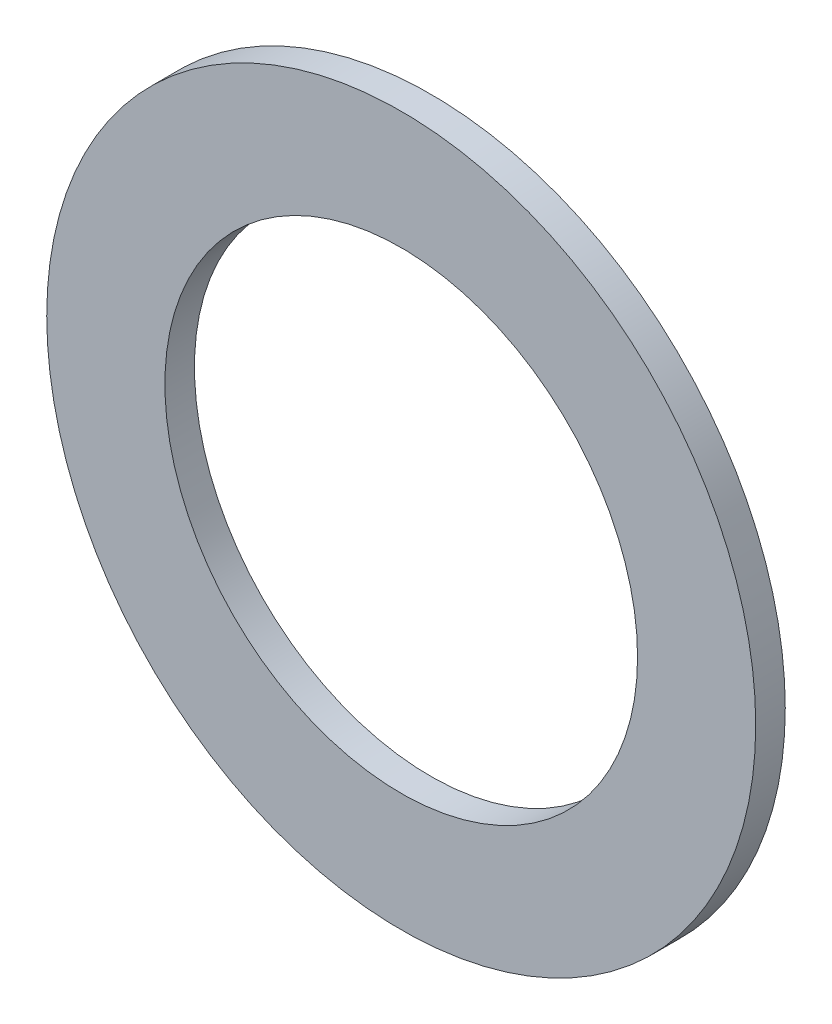
ISO-10303-21;
HEADER;
FILE_DESCRIPTION(('STEP AP214'),'2;1');
FILE_NAME('part.step','',(''),(''),'','','');
FILE_SCHEMA(('AUTOMOTIVE_DESIGN { 1 0 10303 214 1 1 1 1 }'));
ENDSEC;
DATA;
#1=APPLICATION_CONTEXT('core data for automotive mechanical design processes');
#2=APPLICATION_PROTOCOL_DEFINITION('international standard','automotive_design',2000,#1);
#3=PRODUCT_CONTEXT('',#1,'mechanical');
#4=PRODUCT('Part','Part','',(#3));
#5=PRODUCT_RELATED_PRODUCT_CATEGORY('part','',(#4));
#6=PRODUCT_DEFINITION_FORMATION('','',#4);
#7=PRODUCT_DEFINITION_CONTEXT('part definition',#1,'design');
#8=PRODUCT_DEFINITION('design','',#6,#7);
#9=PRODUCT_DEFINITION_SHAPE('','',#8);
#10=(LENGTH_UNIT() NAMED_UNIT(*) SI_UNIT(.MILLI.,.METRE.));
#11=(NAMED_UNIT(*) PLANE_ANGLE_UNIT() SI_UNIT($,.RADIAN.));
#12=(NAMED_UNIT(*) SI_UNIT($,.STERADIAN.) SOLID_ANGLE_UNIT());
#13=UNCERTAINTY_MEASURE_WITH_UNIT(LENGTH_MEASURE(1.E-05),#10,'distance_accuracy_value','');
#14=(GEOMETRIC_REPRESENTATION_CONTEXT(3) GLOBAL_UNCERTAINTY_ASSIGNED_CONTEXT((#13)) GLOBAL_UNIT_ASSIGNED_CONTEXT((#10,
#11,#12)) REPRESENTATION_CONTEXT('',''));
#15=CARTESIAN_POINT('',(0.,0.,0.));
#16=DIRECTION('',(0.,0.,1.));
#17=DIRECTION('',(1.,0.,0.));
#18=AXIS2_PLACEMENT_3D('',#15,#16,#17);
#19=CARTESIAN_POINT('',(0.,0.,0.5));
#20=DIRECTION('',(0.,0.,1.));
#21=DIRECTION('',(1.,0.,0.));
#22=AXIS2_PLACEMENT_3D('',#19,#20,#21);
#23=PLANE('',#22);
#24=CARTESIAN_POINT('',(0.,0.,0.5));
#25=DIRECTION('',(0.,0.,1.));
#26=DIRECTION('',(1.,0.,0.));
#27=AXIS2_PLACEMENT_3D('',#24,#25,#26);
#28=CIRCLE('',#27,6.);
#29=CARTESIAN_POINT('',(6.,0.,0.5));
#30=VERTEX_POINT('',#29);
#31=EDGE_CURVE('E10',#30,#30,#28,.T.);
#32=ORIENTED_EDGE('',*,*,#31,.T.);
#33=EDGE_LOOP('',(#32));
#34=FACE_BOUND('',#33,.T.);
#35=CARTESIAN_POINT('',(0.,0.,0.5));
#36=DIRECTION('',(0.,0.,1.));
#37=DIRECTION('',(1.,0.,0.));
#38=AXIS2_PLACEMENT_3D('',#35,#36,#37);
#39=CIRCLE('',#38,4.);
#40=CARTESIAN_POINT('',(4.,0.,0.5));
#41=VERTEX_POINT('',#40);
#42=EDGE_CURVE('E42',#41,#41,#39,.T.);
#43=ORIENTED_EDGE('',*,*,#42,.F.);
#44=EDGE_LOOP('',(#43));
#45=FACE_BOUND('',#44,.T.);
#46=ADVANCED_FACE('F31',(#34,#45),#23,.T.);
#47=CARTESIAN_POINT('',(0.,0.,0.));
#48=DIRECTION('',(0.,0.,1.));
#49=DIRECTION('',(1.,0.,0.));
#50=AXIS2_PLACEMENT_3D('',#47,#48,#49);
#51=PLANE('',#50);
#52=CARTESIAN_POINT('',(0.,0.,0.));
#53=DIRECTION('',(0.,0.,1.));
#54=DIRECTION('',(1.,0.,0.));
#55=AXIS2_PLACEMENT_3D('',#52,#53,#54);
#56=CIRCLE('',#55,6.);
#57=CARTESIAN_POINT('',(6.,0.,0.));
#58=VERTEX_POINT('',#57);
#59=EDGE_CURVE('E35',#58,#58,#56,.T.);
#60=ORIENTED_EDGE('',*,*,#59,.F.);
#61=EDGE_LOOP('',(#60));
#62=FACE_BOUND('',#61,.T.);
#63=CARTESIAN_POINT('',(0.,0.,0.));
#64=DIRECTION('',(0.,0.,1.));
#65=DIRECTION('',(1.,0.,0.));
#66=AXIS2_PLACEMENT_3D('',#63,#64,#65);
#67=CIRCLE('',#66,4.);
#68=CARTESIAN_POINT('',(4.,0.,0.));
#69=VERTEX_POINT('',#68);
#70=EDGE_CURVE('E44',#69,#69,#67,.T.);
#71=ORIENTED_EDGE('',*,*,#70,.T.);
#72=EDGE_LOOP('',(#71));
#73=FACE_BOUND('',#72,.T.);
#74=ADVANCED_FACE('F54',(#62,#73),#51,.F.);
#75=CARTESIAN_POINT('',(0.,0.,0.5));
#76=DIRECTION('',(0.,0.,-1.));
#77=DIRECTION('',(-1.,0.,0.));
#78=AXIS2_PLACEMENT_3D('',#75,#76,#77);
#79=CYLINDRICAL_SURFACE('',#78,6.);
#80=ORIENTED_EDGE('',*,*,#31,.F.);
#81=EDGE_LOOP('',(#80));
#82=FACE_BOUND('',#81,.T.);
#83=ORIENTED_EDGE('',*,*,#59,.T.);
#84=EDGE_LOOP('',(#83));
#85=FACE_BOUND('',#84,.T.);
#86=ADVANCED_FACE('F33',(#82,#85),#79,.T.);
#87=CARTESIAN_POINT('',(0.,0.,0.5));
#88=DIRECTION('',(0.,0.,-1.));
#89=DIRECTION('',(-1.,0.,0.));
#90=AXIS2_PLACEMENT_3D('',#87,#88,#89);
#91=CYLINDRICAL_SURFACE('',#90,4.);
#92=ORIENTED_EDGE('',*,*,#42,.T.);
#93=EDGE_LOOP('',(#92));
#94=FACE_BOUND('',#93,.T.);
#95=ORIENTED_EDGE('',*,*,#70,.F.);
#96=EDGE_LOOP('',(#95));
#97=FACE_BOUND('',#96,.T.);
#98=ADVANCED_FACE('F50',(#94,#97),#91,.F.);
#99=CLOSED_SHELL('',(#46,#74,#86,#98));
#100=MANIFOLD_SOLID_BREP('B2',#99);
#101=ADVANCED_BREP_SHAPE_REPRESENTATION('',(#18,#100),#14);
#102=SHAPE_DEFINITION_REPRESENTATION(#9,#101);
ENDSEC;
END-ISO-10303-21;
